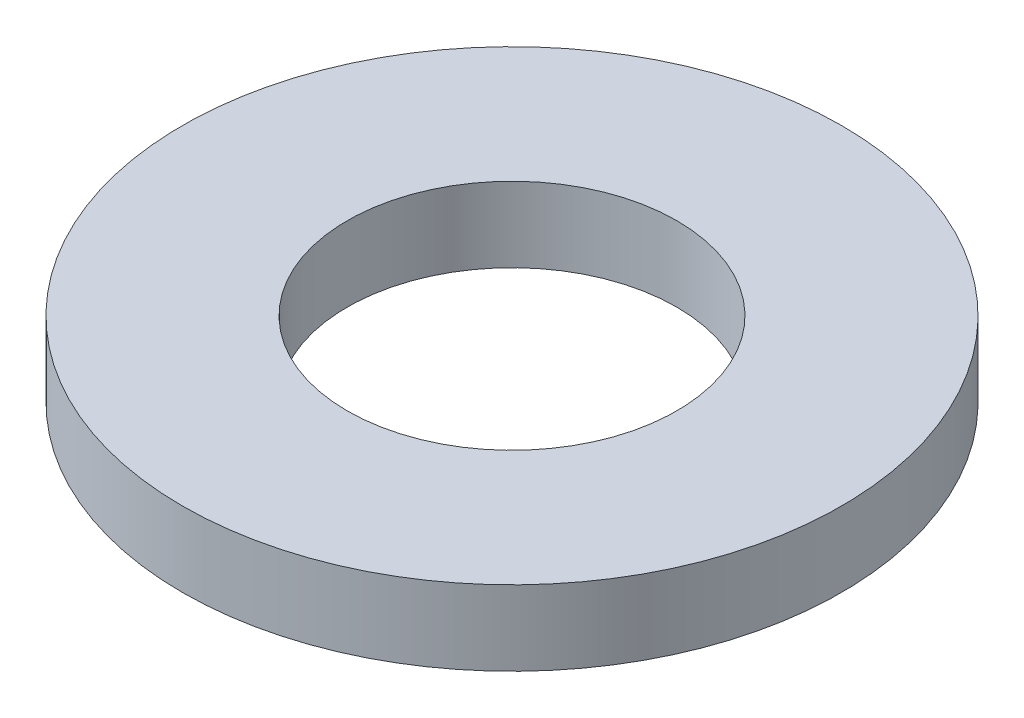
ISO-10303-21;
HEADER;
FILE_DESCRIPTION(('STEP AP214'),'2;1');
FILE_NAME('part.step','',(''),(''),'','','');
FILE_SCHEMA(('AUTOMOTIVE_DESIGN { 1 0 10303 214 1 1 1 1 }'));
ENDSEC;
DATA;
#1=APPLICATION_CONTEXT('core data for automotive mechanical design processes');
#2=APPLICATION_PROTOCOL_DEFINITION('international standard','automotive_design',2000,#1);
#3=PRODUCT_CONTEXT('',#1,'mechanical');
#4=PRODUCT('Part','Part','',(#3));
#5=PRODUCT_RELATED_PRODUCT_CATEGORY('part','',(#4));
#6=PRODUCT_DEFINITION_FORMATION('','',#4);
#7=PRODUCT_DEFINITION_CONTEXT('part definition',#1,'design');
#8=PRODUCT_DEFINITION('design','',#6,#7);
#9=PRODUCT_DEFINITION_SHAPE('','',#8);
#10=(LENGTH_UNIT() NAMED_UNIT(*) SI_UNIT(.MILLI.,.METRE.));
#11=(NAMED_UNIT(*) PLANE_ANGLE_UNIT() SI_UNIT($,.RADIAN.));
#12=(NAMED_UNIT(*) SI_UNIT($,.STERADIAN.) SOLID_ANGLE_UNIT());
#13=UNCERTAINTY_MEASURE_WITH_UNIT(LENGTH_MEASURE(1.E-05),#10,'distance_accuracy_value','');
#14=(GEOMETRIC_REPRESENTATION_CONTEXT(3) GLOBAL_UNCERTAINTY_ASSIGNED_CONTEXT((#13)) GLOBAL_UNIT_ASSIGNED_CONTEXT((#10,
#11,#12)) REPRESENTATION_CONTEXT('',''));
#15=CARTESIAN_POINT('',(0.,0.,0.));
#16=DIRECTION('',(0.,0.,1.));
#17=DIRECTION('',(1.,0.,0.));
#18=AXIS2_PLACEMENT_3D('',#15,#16,#17);
#19=CARTESIAN_POINT('',(0.,168.928571428572,0.));
#20=DIRECTION('',(0.,1.,0.));
#21=DIRECTION('',(0.,0.,1.));
#22=AXIS2_PLACEMENT_3D('',#19,#20,#21);
#23=CYLINDRICAL_SURFACE('',#22,110.);
#24=CARTESIAN_POINT('',(0.,12.5,0.));
#25=DIRECTION('',(0.,1.,0.));
#26=DIRECTION('',(0.,0.,1.));
#27=AXIS2_PLACEMENT_3D('',#24,#25,#26);
#28=CIRCLE('',#27,110.);
#29=CARTESIAN_POINT('',(0.,12.5,110.));
#30=VERTEX_POINT('',#29);
#31=EDGE_CURVE('E10',#30,#30,#28,.T.);
#32=ORIENTED_EDGE('',*,*,#31,.F.);
#33=EDGE_LOOP('',(#32));
#34=FACE_BOUND('',#33,.T.);
#35=CARTESIAN_POINT('',(0.,-12.5,0.));
#36=DIRECTION('',(0.,1.,0.));
#37=DIRECTION('',(0.,0.,1.));
#38=AXIS2_PLACEMENT_3D('',#35,#36,#37);
#39=CIRCLE('',#38,110.);
#40=CARTESIAN_POINT('',(0.,-12.5,110.));
#41=VERTEX_POINT('',#40);
#42=EDGE_CURVE('E54',#41,#41,#39,.T.);
#43=ORIENTED_EDGE('',*,*,#42,.T.);
#44=EDGE_LOOP('',(#43));
#45=FACE_BOUND('',#44,.T.);
#46=ADVANCED_FACE('F37',(#34,#45),#23,.T.);
#47=CARTESIAN_POINT('',(55.,12.5,0.));
#48=DIRECTION('',(0.,-1.,0.));
#49=DIRECTION('',(0.,0.,-1.));
#50=AXIS2_PLACEMENT_3D('',#47,#48,#49);
#51=PLANE('',#50);
#52=CARTESIAN_POINT('',(0.,12.5,0.));
#53=DIRECTION('',(0.,1.,0.));
#54=DIRECTION('',(0.,0.,1.));
#55=AXIS2_PLACEMENT_3D('',#52,#53,#54);
#56=CIRCLE('',#55,55.);
#57=CARTESIAN_POINT('',(0.,12.5,55.));
#58=VERTEX_POINT('',#57);
#59=EDGE_CURVE('E44',#58,#58,#56,.T.);
#60=ORIENTED_EDGE('',*,*,#59,.F.);
#61=EDGE_LOOP('',(#60));
#62=FACE_BOUND('',#61,.T.);
#63=ORIENTED_EDGE('',*,*,#31,.T.);
#64=EDGE_LOOP('',(#63));
#65=FACE_BOUND('',#64,.T.);
#66=ADVANCED_FACE('F70',(#62,#65),#51,.F.);
#67=CARTESIAN_POINT('',(0.,168.928571428572,0.));
#68=DIRECTION('',(0.,1.,0.));
#69=DIRECTION('',(0.,0.,1.));
#70=AXIS2_PLACEMENT_3D('',#67,#68,#69);
#71=CYLINDRICAL_SURFACE('',#70,55.);
#72=CARTESIAN_POINT('',(0.,-12.5,0.));
#73=DIRECTION('',(0.,1.,0.));
#74=DIRECTION('',(0.,0.,1.));
#75=AXIS2_PLACEMENT_3D('',#72,#73,#74);
#76=CIRCLE('',#75,55.);
#77=CARTESIAN_POINT('',(0.,-12.5,55.));
#78=VERTEX_POINT('',#77);
#79=EDGE_CURVE('E49',#78,#78,#76,.T.);
#80=ORIENTED_EDGE('',*,*,#79,.F.);
#81=EDGE_LOOP('',(#80));
#82=FACE_BOUND('',#81,.T.);
#83=ORIENTED_EDGE('',*,*,#59,.T.);
#84=EDGE_LOOP('',(#83));
#85=FACE_BOUND('',#84,.T.);
#86=ADVANCED_FACE('F65',(#82,#85),#71,.F.);
#87=CARTESIAN_POINT('',(55.,-12.5,0.));
#88=DIRECTION('',(0.,1.,0.));
#89=DIRECTION('',(0.,0.,1.));
#90=AXIS2_PLACEMENT_3D('',#87,#88,#89);
#91=PLANE('',#90);
#92=ORIENTED_EDGE('',*,*,#42,.F.);
#93=EDGE_LOOP('',(#92));
#94=FACE_BOUND('',#93,.T.);
#95=ORIENTED_EDGE('',*,*,#79,.T.);
#96=EDGE_LOOP('',(#95));
#97=FACE_BOUND('',#96,.T.);
#98=ADVANCED_FACE('F62',(#94,#97),#91,.F.);
#99=CLOSED_SHELL('',(#46,#66,#86,#98));
#100=MANIFOLD_SOLID_BREP('B2',#99);
#101=ADVANCED_BREP_SHAPE_REPRESENTATION('',(#18,#100),#14);
#102=SHAPE_DEFINITION_REPRESENTATION(#9,#101);
ENDSEC;
END-ISO-10303-21;
